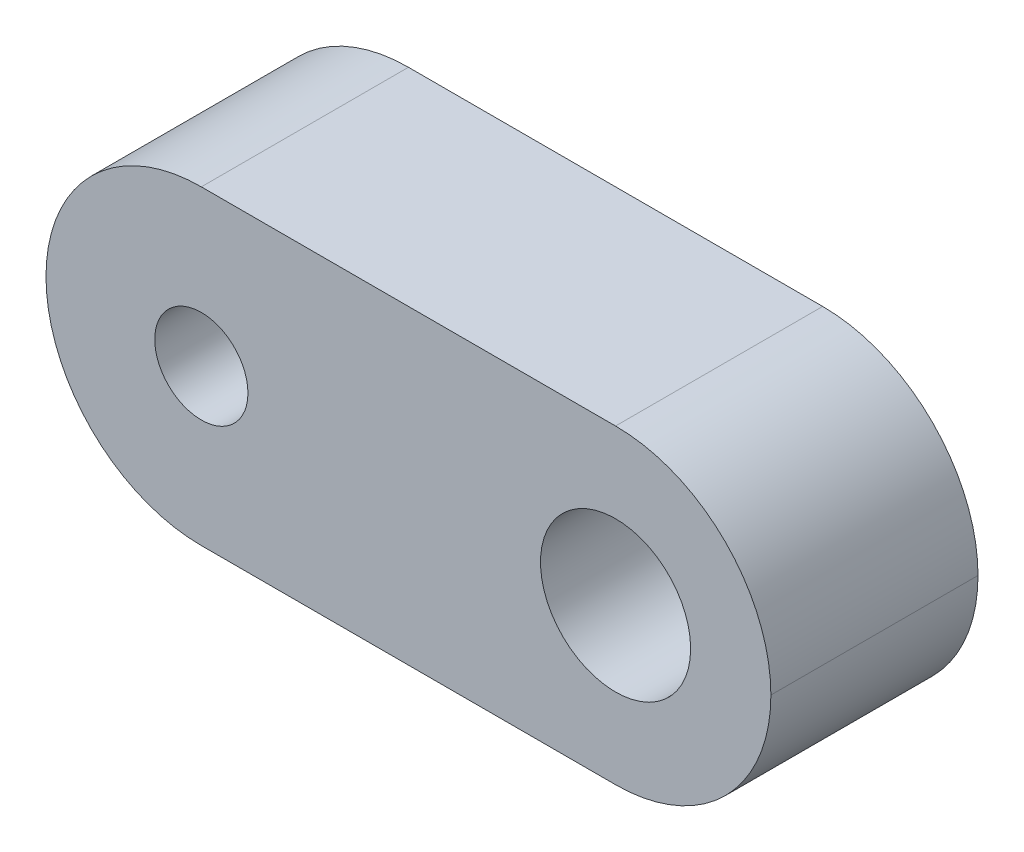
ISO-10303-21;
HEADER;
FILE_DESCRIPTION(('STEP AP214'),'2;1');
FILE_NAME('part.step','',(''),(''),'','','');
FILE_SCHEMA(('AUTOMOTIVE_DESIGN { 1 0 10303 214 1 1 1 1 }'));
ENDSEC;
DATA;
#1=APPLICATION_CONTEXT('core data for automotive mechanical design processes');
#2=APPLICATION_PROTOCOL_DEFINITION('international standard','automotive_design',2000,#1);
#3=PRODUCT_CONTEXT('',#1,'mechanical');
#4=PRODUCT('Part','Part','',(#3));
#5=PRODUCT_RELATED_PRODUCT_CATEGORY('part','',(#4));
#6=PRODUCT_DEFINITION_FORMATION('','',#4);
#7=PRODUCT_DEFINITION_CONTEXT('part definition',#1,'design');
#8=PRODUCT_DEFINITION('design','',#6,#7);
#9=PRODUCT_DEFINITION_SHAPE('','',#8);
#10=(LENGTH_UNIT() NAMED_UNIT(*) SI_UNIT(.MILLI.,.METRE.));
#11=(NAMED_UNIT(*) PLANE_ANGLE_UNIT() SI_UNIT($,.RADIAN.));
#12=(NAMED_UNIT(*) SI_UNIT($,.STERADIAN.) SOLID_ANGLE_UNIT());
#13=UNCERTAINTY_MEASURE_WITH_UNIT(LENGTH_MEASURE(1.E-05),#10,'distance_accuracy_value','');
#14=(GEOMETRIC_REPRESENTATION_CONTEXT(3) GLOBAL_UNCERTAINTY_ASSIGNED_CONTEXT((#13)) GLOBAL_UNIT_ASSIGNED_CONTEXT((#10,
#11,#12)) REPRESENTATION_CONTEXT('',''));
#15=CARTESIAN_POINT('',(0.,0.,0.));
#16=DIRECTION('',(0.,0.,1.));
#17=DIRECTION('',(1.,0.,0.));
#18=AXIS2_PLACEMENT_3D('',#15,#16,#17);
#19=CARTESIAN_POINT('',(0.,-6.,4.));
#20=DIRECTION('',(0.,1.,0.));
#21=DIRECTION('',(0.,0.,1.));
#22=AXIS2_PLACEMENT_3D('',#19,#20,#21);
#23=PLANE('',#22);
#24=DIRECTION('',(1.,0.,0.));
#25=VECTOR('',#24,1.);
#26=CARTESIAN_POINT('',(0.,-6.,0.));
#27=LINE('',#26,#25);
#28=CARTESIAN_POINT('',(3.,-6.,0.));
#29=VERTEX_POINT('',#28);
#30=CARTESIAN_POINT('',(11.,-6.,0.));
#31=VERTEX_POINT('',#30);
#32=EDGE_CURVE('E92',#29,#31,#27,.T.);
#33=ORIENTED_EDGE('',*,*,#32,.T.);
#34=DIRECTION('',(0.,0.,-1.));
#35=VECTOR('',#34,1.);
#36=CARTESIAN_POINT('',(11.,-6.,4.));
#37=LINE('',#36,#35);
#38=CARTESIAN_POINT('',(11.,-6.,4.));
#39=VERTEX_POINT('',#38);
#40=EDGE_CURVE('E124',#31,#39,#37,.F.);
#41=ORIENTED_EDGE('',*,*,#40,.T.);
#42=DIRECTION('',(1.,0.,0.));
#43=VECTOR('',#42,1.);
#44=CARTESIAN_POINT('',(0.,-6.,4.));
#45=LINE('',#44,#43);
#46=CARTESIAN_POINT('',(3.,-6.,4.));
#47=VERTEX_POINT('',#46);
#48=EDGE_CURVE('E134',#47,#39,#45,.T.);
#49=ORIENTED_EDGE('',*,*,#48,.F.);
#50=DIRECTION('',(0.,0.,-1.));
#51=VECTOR('',#50,1.);
#52=CARTESIAN_POINT('',(3.,-6.,4.));
#53=LINE('',#52,#51);
#54=EDGE_CURVE('E127',#47,#29,#53,.T.);
#55=ORIENTED_EDGE('',*,*,#54,.T.);
#56=EDGE_LOOP('',(#33,#41,#49,#55));
#57=FACE_BOUND('',#56,.T.);
#58=ADVANCED_FACE('F33',(#57),#23,.F.);
#59=CARTESIAN_POINT('',(0.,0.,4.));
#60=DIRECTION('',(0.,-1.,0.));
#61=DIRECTION('',(0.,0.,-1.));
#62=AXIS2_PLACEMENT_3D('',#59,#60,#61);
#63=PLANE('',#62);
#64=DIRECTION('',(-1.,0.,0.));
#65=VECTOR('',#64,1.);
#66=CARTESIAN_POINT('',(0.,0.,4.));
#67=LINE('',#66,#65);
#68=CARTESIAN_POINT('',(11.,0.,4.));
#69=VERTEX_POINT('',#68);
#70=CARTESIAN_POINT('',(3.,0.,4.));
#71=VERTEX_POINT('',#70);
#72=EDGE_CURVE('E103',#69,#71,#67,.T.);
#73=ORIENTED_EDGE('',*,*,#72,.F.);
#74=DIRECTION('',(0.,0.,-1.));
#75=VECTOR('',#74,1.);
#76=CARTESIAN_POINT('',(11.,0.,4.));
#77=LINE('',#76,#75);
#78=CARTESIAN_POINT('',(11.,0.,0.));
#79=VERTEX_POINT('',#78);
#80=EDGE_CURVE('E11',#69,#79,#77,.T.);
#81=ORIENTED_EDGE('',*,*,#80,.T.);
#82=DIRECTION('',(-1.,0.,0.));
#83=VECTOR('',#82,1.);
#84=CARTESIAN_POINT('',(0.,0.,0.));
#85=LINE('',#84,#83);
#86=CARTESIAN_POINT('',(3.,0.,0.));
#87=VERTEX_POINT('',#86);
#88=EDGE_CURVE('E132',#79,#87,#85,.T.);
#89=ORIENTED_EDGE('',*,*,#88,.T.);
#90=DIRECTION('',(0.,0.,-1.));
#91=VECTOR('',#90,1.);
#92=CARTESIAN_POINT('',(3.,0.,4.));
#93=LINE('',#92,#91);
#94=EDGE_CURVE('E42',#87,#71,#93,.F.);
#95=ORIENTED_EDGE('',*,*,#94,.T.);
#96=EDGE_LOOP('',(#73,#81,#89,#95));
#97=FACE_BOUND('',#96,.T.);
#98=ADVANCED_FACE('F154',(#97),#63,.F.);
#99=CARTESIAN_POINT('',(0.,0.,4.));
#100=DIRECTION('',(0.,0.,1.));
#101=DIRECTION('',(1.,0.,0.));
#102=AXIS2_PLACEMENT_3D('',#99,#100,#101);
#103=PLANE('',#102);
#104=CARTESIAN_POINT('',(11.,-3.,4.));
#105=DIRECTION('',(0.,0.,1.));
#106=DIRECTION('',(1.,0.,0.));
#107=AXIS2_PLACEMENT_3D('',#104,#105,#106);
#108=CIRCLE('',#107,1.45);
#109=CARTESIAN_POINT('',(12.45,-3.,4.));
#110=VERTEX_POINT('',#109);
#111=EDGE_CURVE('E114',#110,#110,#108,.T.);
#112=ORIENTED_EDGE('',*,*,#111,.F.);
#113=EDGE_LOOP('',(#112));
#114=FACE_BOUND('',#113,.T.);
#115=CARTESIAN_POINT('',(3.,-3.,4.));
#116=DIRECTION('',(0.,0.,1.));
#117=DIRECTION('',(1.,0.,0.));
#118=AXIS2_PLACEMENT_3D('',#115,#116,#117);
#119=CIRCLE('',#118,0.9);
#120=CARTESIAN_POINT('',(3.9,-3.,4.));
#121=VERTEX_POINT('',#120);
#122=EDGE_CURVE('E136',#121,#121,#119,.T.);
#123=ORIENTED_EDGE('',*,*,#122,.F.);
#124=EDGE_LOOP('',(#123));
#125=FACE_BOUND('',#124,.T.);
#126=ORIENTED_EDGE('',*,*,#48,.T.);
#127=CARTESIAN_POINT('',(11.,-3.,4.));
#128=DIRECTION('',(0.,0.,1.));
#129=DIRECTION('',(1.,0.,0.));
#130=AXIS2_PLACEMENT_3D('',#127,#128,#129);
#131=CIRCLE('',#130,3.);
#132=CARTESIAN_POINT('',(14.,-3.,4.));
#133=VERTEX_POINT('',#132);
#134=EDGE_CURVE('E118',#39,#133,#131,.T.);
#135=ORIENTED_EDGE('',*,*,#134,.T.);
#136=CARTESIAN_POINT('',(11.,-3.,4.));
#137=DIRECTION('',(0.,0.,1.));
#138=DIRECTION('',(1.,0.,0.));
#139=AXIS2_PLACEMENT_3D('',#136,#137,#138);
#140=CIRCLE('',#139,3.);
#141=EDGE_CURVE('E56',#133,#69,#140,.T.);
#142=ORIENTED_EDGE('',*,*,#141,.T.);
#143=ORIENTED_EDGE('',*,*,#72,.T.);
#144=CARTESIAN_POINT('',(3.,-3.,4.));
#145=DIRECTION('',(0.,0.,1.));
#146=DIRECTION('',(1.,0.,0.));
#147=AXIS2_PLACEMENT_3D('',#144,#145,#146);
#148=CIRCLE('',#147,3.);
#149=CARTESIAN_POINT('',(0.,-3.,4.));
#150=VERTEX_POINT('',#149);
#151=EDGE_CURVE('E122',#71,#150,#148,.T.);
#152=ORIENTED_EDGE('',*,*,#151,.T.);
#153=CARTESIAN_POINT('',(3.,-3.,4.));
#154=DIRECTION('',(0.,0.,1.));
#155=DIRECTION('',(1.,0.,0.));
#156=AXIS2_PLACEMENT_3D('',#153,#154,#155);
#157=CIRCLE('',#156,3.);
#158=EDGE_CURVE('E106',#150,#47,#157,.T.);
#159=ORIENTED_EDGE('',*,*,#158,.T.);
#160=EDGE_LOOP('',(#126,#135,#142,#143,#152,#159));
#161=FACE_BOUND('',#160,.T.);
#162=ADVANCED_FACE('F151',(#114,#125,#161),#103,.T.);
#163=CARTESIAN_POINT('',(0.,0.,0.));
#164=DIRECTION('',(0.,0.,1.));
#165=DIRECTION('',(1.,0.,0.));
#166=AXIS2_PLACEMENT_3D('',#163,#164,#165);
#167=PLANE('',#166);
#168=CARTESIAN_POINT('',(11.,-3.,0.));
#169=DIRECTION('',(0.,0.,1.));
#170=DIRECTION('',(1.,0.,0.));
#171=AXIS2_PLACEMENT_3D('',#168,#169,#170);
#172=CIRCLE('',#171,1.45);
#173=CARTESIAN_POINT('',(12.45,-3.,0.));
#174=VERTEX_POINT('',#173);
#175=EDGE_CURVE('E109',#174,#174,#172,.T.);
#176=ORIENTED_EDGE('',*,*,#175,.T.);
#177=EDGE_LOOP('',(#176));
#178=FACE_BOUND('',#177,.T.);
#179=CARTESIAN_POINT('',(3.,-3.,0.));
#180=DIRECTION('',(0.,0.,1.));
#181=DIRECTION('',(1.,0.,0.));
#182=AXIS2_PLACEMENT_3D('',#179,#180,#181);
#183=CIRCLE('',#182,0.9);
#184=CARTESIAN_POINT('',(3.9,-3.,0.));
#185=VERTEX_POINT('',#184);
#186=EDGE_CURVE('E142',#185,#185,#183,.T.);
#187=ORIENTED_EDGE('',*,*,#186,.T.);
#188=EDGE_LOOP('',(#187));
#189=FACE_BOUND('',#188,.T.);
#190=CARTESIAN_POINT('',(11.,-3.,0.));
#191=DIRECTION('',(0.,0.,1.));
#192=DIRECTION('',(1.,0.,0.));
#193=AXIS2_PLACEMENT_3D('',#190,#191,#192);
#194=CIRCLE('',#193,3.);
#195=CARTESIAN_POINT('',(14.,-3.,0.));
#196=VERTEX_POINT('',#195);
#197=EDGE_CURVE('E97',#79,#196,#194,.F.);
#198=ORIENTED_EDGE('',*,*,#197,.T.);
#199=CARTESIAN_POINT('',(11.,-3.,0.));
#200=DIRECTION('',(0.,0.,1.));
#201=DIRECTION('',(1.,0.,0.));
#202=AXIS2_PLACEMENT_3D('',#199,#200,#201);
#203=CIRCLE('',#202,3.);
#204=EDGE_CURVE('E129',#196,#31,#203,.F.);
#205=ORIENTED_EDGE('',*,*,#204,.T.);
#206=ORIENTED_EDGE('',*,*,#32,.F.);
#207=CARTESIAN_POINT('',(3.,-3.,0.));
#208=DIRECTION('',(0.,0.,1.));
#209=DIRECTION('',(1.,0.,0.));
#210=AXIS2_PLACEMENT_3D('',#207,#208,#209);
#211=CIRCLE('',#210,3.);
#212=CARTESIAN_POINT('',(0.,-3.,0.));
#213=VERTEX_POINT('',#212);
#214=EDGE_CURVE('E86',#29,#213,#211,.F.);
#215=ORIENTED_EDGE('',*,*,#214,.T.);
#216=CARTESIAN_POINT('',(3.,-3.,0.));
#217=DIRECTION('',(0.,0.,1.));
#218=DIRECTION('',(1.,0.,0.));
#219=AXIS2_PLACEMENT_3D('',#216,#217,#218);
#220=CIRCLE('',#219,3.);
#221=EDGE_CURVE('E90',#213,#87,#220,.F.);
#222=ORIENTED_EDGE('',*,*,#221,.T.);
#223=ORIENTED_EDGE('',*,*,#88,.F.);
#224=EDGE_LOOP('',(#198,#205,#206,#215,#222,#223));
#225=FACE_BOUND('',#224,.T.);
#226=ADVANCED_FACE('F88',(#178,#189,#225),#167,.F.);
#227=CARTESIAN_POINT('',(3.,-3.,0.));
#228=DIRECTION('',(0.,0.,1.));
#229=DIRECTION('',(1.,0.,0.));
#230=AXIS2_PLACEMENT_3D('',#227,#228,#229);
#231=CYLINDRICAL_SURFACE('',#230,0.9);
#232=ORIENTED_EDGE('',*,*,#122,.T.);
#233=EDGE_LOOP('',(#232));
#234=FACE_BOUND('',#233,.T.);
#235=ORIENTED_EDGE('',*,*,#186,.F.);
#236=EDGE_LOOP('',(#235));
#237=FACE_BOUND('',#236,.T.);
#238=ADVANCED_FACE('F197',(#234,#237),#231,.F.);
#239=CARTESIAN_POINT('',(11.,-3.,0.));
#240=DIRECTION('',(0.,0.,1.));
#241=DIRECTION('',(1.,0.,0.));
#242=AXIS2_PLACEMENT_3D('',#239,#240,#241);
#243=CYLINDRICAL_SURFACE('',#242,1.45);
#244=ORIENTED_EDGE('',*,*,#111,.T.);
#245=EDGE_LOOP('',(#244));
#246=FACE_BOUND('',#245,.T.);
#247=ORIENTED_EDGE('',*,*,#175,.F.);
#248=EDGE_LOOP('',(#247));
#249=FACE_BOUND('',#248,.T.);
#250=ADVANCED_FACE('F148',(#246,#249),#243,.F.);
#251=CARTESIAN_POINT('',(11.,-3.,4.));
#252=DIRECTION('',(0.,0.,-1.));
#253=DIRECTION('',(-1.,0.,0.));
#254=AXIS2_PLACEMENT_3D('',#251,#252,#253);
#255=CYLINDRICAL_SURFACE('',#254,3.);
#256=ORIENTED_EDGE('',*,*,#80,.F.);
#257=ORIENTED_EDGE('',*,*,#141,.F.);
#258=DIRECTION('',(0.,0.,-1.));
#259=VECTOR('',#258,1.);
#260=CARTESIAN_POINT('',(14.,-3.,4.));
#261=LINE('',#260,#259);
#262=EDGE_CURVE('E107',#196,#133,#261,.F.);
#263=ORIENTED_EDGE('',*,*,#262,.F.);
#264=ORIENTED_EDGE('',*,*,#197,.F.);
#265=EDGE_LOOP('',(#256,#257,#263,#264));
#266=FACE_BOUND('',#265,.T.);
#267=ADVANCED_FACE('F164',(#266),#255,.T.);
#268=CARTESIAN_POINT('',(11.,-3.,4.));
#269=DIRECTION('',(0.,0.,-1.));
#270=DIRECTION('',(-1.,0.,0.));
#271=AXIS2_PLACEMENT_3D('',#268,#269,#270);
#272=CYLINDRICAL_SURFACE('',#271,3.);
#273=ORIENTED_EDGE('',*,*,#134,.F.);
#274=ORIENTED_EDGE('',*,*,#40,.F.);
#275=ORIENTED_EDGE('',*,*,#204,.F.);
#276=ORIENTED_EDGE('',*,*,#262,.T.);
#277=EDGE_LOOP('',(#273,#274,#275,#276));
#278=FACE_BOUND('',#277,.T.);
#279=ADVANCED_FACE('F160',(#278),#272,.T.);
#280=CARTESIAN_POINT('',(3.,-3.,4.));
#281=DIRECTION('',(0.,0.,-1.));
#282=DIRECTION('',(-1.,0.,0.));
#283=AXIS2_PLACEMENT_3D('',#280,#281,#282);
#284=CYLINDRICAL_SURFACE('',#283,3.);
#285=DIRECTION('',(0.,0.,-1.));
#286=VECTOR('',#285,1.);
#287=CARTESIAN_POINT('',(0.,-3.,4.));
#288=LINE('',#287,#286);
#289=EDGE_CURVE('E37',#150,#213,#288,.T.);
#290=ORIENTED_EDGE('',*,*,#289,.F.);
#291=ORIENTED_EDGE('',*,*,#151,.F.);
#292=ORIENTED_EDGE('',*,*,#94,.F.);
#293=ORIENTED_EDGE('',*,*,#221,.F.);
#294=EDGE_LOOP('',(#290,#291,#292,#293));
#295=FACE_BOUND('',#294,.T.);
#296=ADVANCED_FACE('F35',(#295),#284,.T.);
#297=CARTESIAN_POINT('',(3.,-3.,4.));
#298=DIRECTION('',(0.,0.,-1.));
#299=DIRECTION('',(-1.,0.,0.));
#300=AXIS2_PLACEMENT_3D('',#297,#298,#299);
#301=CYLINDRICAL_SURFACE('',#300,3.);
#302=ORIENTED_EDGE('',*,*,#158,.F.);
#303=ORIENTED_EDGE('',*,*,#289,.T.);
#304=ORIENTED_EDGE('',*,*,#214,.F.);
#305=ORIENTED_EDGE('',*,*,#54,.F.);
#306=EDGE_LOOP('',(#302,#303,#304,#305));
#307=FACE_BOUND('',#306,.T.);
#308=ADVANCED_FACE('F105',(#307),#301,.T.);
#309=CLOSED_SHELL('',(#58,#98,#162,#226,#238,#250,#267,#279,#296,#308));
#310=MANIFOLD_SOLID_BREP('B2',#309);
#311=ADVANCED_BREP_SHAPE_REPRESENTATION('',(#18,#310),#14);
#312=SHAPE_DEFINITION_REPRESENTATION(#9,#311);
ENDSEC;
END-ISO-10303-21;
